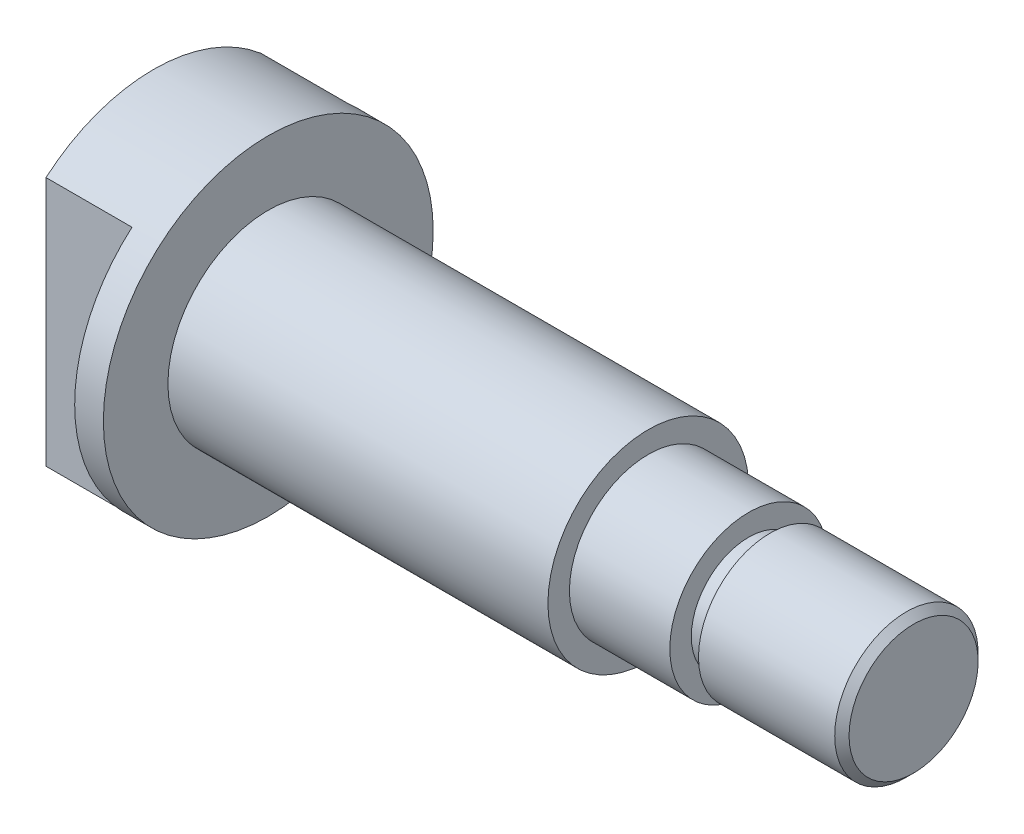
ISO-10303-21;
HEADER;
FILE_DESCRIPTION(('STEP AP214'),'2;1');
FILE_NAME('part.step','',(''),(''),'','','');
FILE_SCHEMA(('AUTOMOTIVE_DESIGN { 1 0 10303 214 1 1 1 1 }'));
ENDSEC;
DATA;
#1=APPLICATION_CONTEXT('core data for automotive mechanical design processes');
#2=APPLICATION_PROTOCOL_DEFINITION('international standard','automotive_design',2000,#1);
#3=PRODUCT_CONTEXT('',#1,'mechanical');
#4=PRODUCT('Part','Part','',(#3));
#5=PRODUCT_RELATED_PRODUCT_CATEGORY('part','',(#4));
#6=PRODUCT_DEFINITION_FORMATION('','',#4);
#7=PRODUCT_DEFINITION_CONTEXT('part definition',#1,'design');
#8=PRODUCT_DEFINITION('design','',#6,#7);
#9=PRODUCT_DEFINITION_SHAPE('','',#8);
#10=(LENGTH_UNIT() NAMED_UNIT(*) SI_UNIT(.MILLI.,.METRE.));
#11=(NAMED_UNIT(*) PLANE_ANGLE_UNIT() SI_UNIT($,.RADIAN.));
#12=(NAMED_UNIT(*) SI_UNIT($,.STERADIAN.) SOLID_ANGLE_UNIT());
#13=UNCERTAINTY_MEASURE_WITH_UNIT(LENGTH_MEASURE(1.E-05),#10,'distance_accuracy_value','');
#14=(GEOMETRIC_REPRESENTATION_CONTEXT(3) GLOBAL_UNCERTAINTY_ASSIGNED_CONTEXT((#13)) GLOBAL_UNIT_ASSIGNED_CONTEXT((#10,
#11,#12)) REPRESENTATION_CONTEXT('',''));
#15=CARTESIAN_POINT('',(0.,0.,0.));
#16=DIRECTION('',(0.,0.,1.));
#17=DIRECTION('',(1.,0.,0.));
#18=AXIS2_PLACEMENT_3D('',#15,#16,#17);
#19=CARTESIAN_POINT('',(0.,0.,0.));
#20=DIRECTION('',(1.,0.,0.));
#21=DIRECTION('',(0.,0.,-1.));
#22=AXIS2_PLACEMENT_3D('',#19,#20,#21);
#23=PLANE('',#22);
#24=CARTESIAN_POINT('',(0.,0.,0.));
#25=DIRECTION('',(-1.,0.,0.));
#26=DIRECTION('',(0.,0.,1.));
#27=AXIS2_PLACEMENT_3D('',#24,#25,#26);
#28=CIRCLE('',#27,23.);
#29=CARTESIAN_POINT('',(0.,17.4355957741627,15.));
#30=VERTEX_POINT('',#29);
#31=CARTESIAN_POINT('',(0.,17.4355957741627,-15.));
#32=VERTEX_POINT('',#31);
#33=EDGE_CURVE('E106',#30,#32,#28,.T.);
#34=ORIENTED_EDGE('',*,*,#33,.T.);
#35=DIRECTION('',(0.,1.,0.));
#36=VECTOR('',#35,1.);
#37=CARTESIAN_POINT('',(0.,17.4355957741627,-15.));
#38=LINE('',#37,#36);
#39=CARTESIAN_POINT('',(0.,-17.4355957741627,-15.));
#40=VERTEX_POINT('',#39);
#41=EDGE_CURVE('E93',#40,#32,#38,.T.);
#42=ORIENTED_EDGE('',*,*,#41,.F.);
#43=CARTESIAN_POINT('',(0.,-17.4355957741627,15.));
#44=VERTEX_POINT('',#43);
#45=EDGE_CURVE('E104',#40,#44,#28,.T.);
#46=ORIENTED_EDGE('',*,*,#45,.T.);
#47=DIRECTION('',(0.,-1.,0.));
#48=VECTOR('',#47,1.);
#49=CARTESIAN_POINT('',(0.,17.4355957741627,15.));
#50=LINE('',#49,#48);
#51=EDGE_CURVE('E191',#30,#44,#50,.T.);
#52=ORIENTED_EDGE('',*,*,#51,.F.);
#53=EDGE_LOOP('',(#34,#42,#46,#52));
#54=FACE_BOUND('',#53,.T.);
#55=ADVANCED_FACE('F49',(#54),#23,.F.);
#56=CARTESIAN_POINT('',(0.,0.,0.));
#57=DIRECTION('',(-1.,0.,0.));
#58=DIRECTION('',(0.,0.,1.));
#59=AXIS2_PLACEMENT_3D('',#56,#57,#58);
#60=CYLINDRICAL_SURFACE('',#59,23.);
#61=CARTESIAN_POINT('',(12.,0.,0.));
#62=DIRECTION('',(-1.,0.,0.));
#63=DIRECTION('',(0.,0.,1.));
#64=AXIS2_PLACEMENT_3D('',#61,#62,#63);
#65=CIRCLE('',#64,23.);
#66=CARTESIAN_POINT('',(12.,17.4355957741627,-15.));
#67=VERTEX_POINT('',#66);
#68=CARTESIAN_POINT('',(12.,-17.4355957741627,-15.));
#69=VERTEX_POINT('',#68);
#70=EDGE_CURVE('E107',#67,#69,#65,.T.);
#71=ORIENTED_EDGE('',*,*,#70,.F.);
#72=DIRECTION('',(-1.,0.,0.));
#73=VECTOR('',#72,1.);
#74=CARTESIAN_POINT('',(12.,17.4355957741627,-15.));
#75=LINE('',#74,#73);
#76=EDGE_CURVE('E98',#67,#32,#75,.T.);
#77=ORIENTED_EDGE('',*,*,#76,.T.);
#78=ORIENTED_EDGE('',*,*,#33,.F.);
#79=DIRECTION('',(-1.,0.,0.));
#80=VECTOR('',#79,1.);
#81=CARTESIAN_POINT('',(12.,17.4355957741627,15.));
#82=LINE('',#81,#80);
#83=CARTESIAN_POINT('',(12.,17.4355957741627,15.));
#84=VERTEX_POINT('',#83);
#85=EDGE_CURVE('E193',#84,#30,#82,.T.);
#86=ORIENTED_EDGE('',*,*,#85,.F.);
#87=CARTESIAN_POINT('',(12.,0.,0.));
#88=DIRECTION('',(-1.,0.,0.));
#89=DIRECTION('',(0.,0.,1.));
#90=AXIS2_PLACEMENT_3D('',#87,#88,#89);
#91=CIRCLE('',#90,23.);
#92=CARTESIAN_POINT('',(12.,-17.4355957741627,15.));
#93=VERTEX_POINT('',#92);
#94=EDGE_CURVE('E189',#93,#84,#91,.T.);
#95=ORIENTED_EDGE('',*,*,#94,.F.);
#96=DIRECTION('',(-1.,0.,0.));
#97=VECTOR('',#96,1.);
#98=CARTESIAN_POINT('',(12.,-17.4355957741627,15.));
#99=LINE('',#98,#97);
#100=EDGE_CURVE('E108',#93,#44,#99,.T.);
#101=ORIENTED_EDGE('',*,*,#100,.T.);
#102=ORIENTED_EDGE('',*,*,#45,.F.);
#103=DIRECTION('',(-1.,0.,0.));
#104=VECTOR('',#103,1.);
#105=CARTESIAN_POINT('',(12.,-17.4355957741627,-15.));
#106=LINE('',#105,#104);
#107=EDGE_CURVE('E90',#69,#40,#106,.T.);
#108=ORIENTED_EDGE('',*,*,#107,.F.);
#109=EDGE_LOOP('',(#71,#77,#78,#86,#95,#101,#102,#108));
#110=FACE_BOUND('',#109,.T.);
#111=CARTESIAN_POINT('',(16.,0.,0.));
#112=DIRECTION('',(-1.,0.,0.));
#113=DIRECTION('',(0.,0.,1.));
#114=AXIS2_PLACEMENT_3D('',#111,#112,#113);
#115=CIRCLE('',#114,23.);
#116=CARTESIAN_POINT('',(16.,0.,23.));
#117=VERTEX_POINT('',#116);
#118=EDGE_CURVE('E114',#117,#117,#115,.T.);
#119=ORIENTED_EDGE('',*,*,#118,.T.);
#120=EDGE_LOOP('',(#119));
#121=FACE_BOUND('',#120,.T.);
#122=ADVANCED_FACE('F111',(#110,#121),#60,.T.);
#123=CARTESIAN_POINT('',(16.,23.,0.));
#124=DIRECTION('',(-1.,0.,0.));
#125=DIRECTION('',(0.,0.,1.));
#126=AXIS2_PLACEMENT_3D('',#123,#124,#125);
#127=PLANE('',#126);
#128=ORIENTED_EDGE('',*,*,#118,.F.);
#129=EDGE_LOOP('',(#128));
#130=FACE_BOUND('',#129,.T.);
#131=CARTESIAN_POINT('',(16.,0.,0.));
#132=DIRECTION('',(-1.,0.,0.));
#133=DIRECTION('',(0.,0.,1.));
#134=AXIS2_PLACEMENT_3D('',#131,#132,#133);
#135=CIRCLE('',#134,14.);
#136=CARTESIAN_POINT('',(16.,0.,14.));
#137=VERTEX_POINT('',#136);
#138=EDGE_CURVE('E117',#137,#137,#135,.T.);
#139=ORIENTED_EDGE('',*,*,#138,.T.);
#140=EDGE_LOOP('',(#139));
#141=FACE_BOUND('',#140,.T.);
#142=ADVANCED_FACE('F144',(#130,#141),#127,.F.);
#143=CARTESIAN_POINT('',(0.,0.,0.));
#144=DIRECTION('',(-1.,0.,0.));
#145=DIRECTION('',(0.,0.,1.));
#146=AXIS2_PLACEMENT_3D('',#143,#144,#145);
#147=CYLINDRICAL_SURFACE('',#146,14.);
#148=ORIENTED_EDGE('',*,*,#138,.F.);
#149=EDGE_LOOP('',(#148));
#150=FACE_BOUND('',#149,.T.);
#151=CARTESIAN_POINT('',(69.,0.,0.));
#152=DIRECTION('',(-1.,0.,0.));
#153=DIRECTION('',(0.,0.,1.));
#154=AXIS2_PLACEMENT_3D('',#151,#152,#153);
#155=CIRCLE('',#154,14.);
#156=CARTESIAN_POINT('',(69.,0.,14.));
#157=VERTEX_POINT('',#156);
#158=EDGE_CURVE('E211',#157,#157,#155,.T.);
#159=ORIENTED_EDGE('',*,*,#158,.T.);
#160=EDGE_LOOP('',(#159));
#161=FACE_BOUND('',#160,.T.);
#162=ADVANCED_FACE('F149',(#150,#161),#147,.T.);
#163=CARTESIAN_POINT('',(69.,14.,0.));
#164=DIRECTION('',(-1.,0.,0.));
#165=DIRECTION('',(0.,0.,1.));
#166=AXIS2_PLACEMENT_3D('',#163,#164,#165);
#167=PLANE('',#166);
#168=ORIENTED_EDGE('',*,*,#158,.F.);
#169=EDGE_LOOP('',(#168));
#170=FACE_BOUND('',#169,.T.);
#171=CARTESIAN_POINT('',(69.,0.,0.));
#172=DIRECTION('',(-1.,0.,0.));
#173=DIRECTION('',(0.,0.,1.));
#174=AXIS2_PLACEMENT_3D('',#171,#172,#173);
#175=CIRCLE('',#174,11.);
#176=CARTESIAN_POINT('',(69.,0.,11.));
#177=VERTEX_POINT('',#176);
#178=EDGE_CURVE('E208',#177,#177,#175,.T.);
#179=ORIENTED_EDGE('',*,*,#178,.T.);
#180=EDGE_LOOP('',(#179));
#181=FACE_BOUND('',#180,.T.);
#182=ADVANCED_FACE('F153',(#170,#181),#167,.F.);
#183=CARTESIAN_POINT('',(0.,0.,0.));
#184=DIRECTION('',(-1.,0.,0.));
#185=DIRECTION('',(0.,0.,1.));
#186=AXIS2_PLACEMENT_3D('',#183,#184,#185);
#187=CYLINDRICAL_SURFACE('',#186,11.);
#188=ORIENTED_EDGE('',*,*,#178,.F.);
#189=EDGE_LOOP('',(#188));
#190=FACE_BOUND('',#189,.T.);
#191=CARTESIAN_POINT('',(83.,0.,0.));
#192=DIRECTION('',(-1.,0.,0.));
#193=DIRECTION('',(0.,0.,1.));
#194=AXIS2_PLACEMENT_3D('',#191,#192,#193);
#195=CIRCLE('',#194,11.);
#196=CARTESIAN_POINT('',(83.,0.,11.));
#197=VERTEX_POINT('',#196);
#198=EDGE_CURVE('E205',#197,#197,#195,.T.);
#199=ORIENTED_EDGE('',*,*,#198,.T.);
#200=EDGE_LOOP('',(#199));
#201=FACE_BOUND('',#200,.T.);
#202=ADVANCED_FACE('F157',(#190,#201),#187,.T.);
#203=CARTESIAN_POINT('',(83.,11.,0.));
#204=DIRECTION('',(-1.,0.,0.));
#205=DIRECTION('',(0.,0.,1.));
#206=AXIS2_PLACEMENT_3D('',#203,#204,#205);
#207=PLANE('',#206);
#208=ORIENTED_EDGE('',*,*,#198,.F.);
#209=EDGE_LOOP('',(#208));
#210=FACE_BOUND('',#209,.T.);
#211=CARTESIAN_POINT('',(83.,0.,0.));
#212=DIRECTION('',(-1.,0.,0.));
#213=DIRECTION('',(0.,0.,1.));
#214=AXIS2_PLACEMENT_3D('',#211,#212,#213);
#215=CIRCLE('',#214,8.);
#216=CARTESIAN_POINT('',(83.,0.,8.));
#217=VERTEX_POINT('',#216);
#218=EDGE_CURVE('E202',#217,#217,#215,.T.);
#219=ORIENTED_EDGE('',*,*,#218,.T.);
#220=EDGE_LOOP('',(#219));
#221=FACE_BOUND('',#220,.T.);
#222=ADVANCED_FACE('F161',(#210,#221),#207,.F.);
#223=CARTESIAN_POINT('',(0.,0.,0.));
#224=DIRECTION('',(-1.,0.,0.));
#225=DIRECTION('',(0.,0.,1.));
#226=AXIS2_PLACEMENT_3D('',#223,#224,#225);
#227=CYLINDRICAL_SURFACE('',#226,8.);
#228=ORIENTED_EDGE('',*,*,#218,.F.);
#229=EDGE_LOOP('',(#228));
#230=FACE_BOUND('',#229,.T.);
#231=CARTESIAN_POINT('',(86.,0.,0.));
#232=DIRECTION('',(-1.,0.,0.));
#233=DIRECTION('',(0.,0.,1.));
#234=AXIS2_PLACEMENT_3D('',#231,#232,#233);
#235=CIRCLE('',#234,8.);
#236=CARTESIAN_POINT('',(86.,0.,8.));
#237=VERTEX_POINT('',#236);
#238=EDGE_CURVE('E199',#237,#237,#235,.T.);
#239=ORIENTED_EDGE('',*,*,#238,.T.);
#240=EDGE_LOOP('',(#239));
#241=FACE_BOUND('',#240,.T.);
#242=ADVANCED_FACE('F165',(#230,#241),#227,.T.);
#243=CARTESIAN_POINT('',(86.,8.,0.));
#244=DIRECTION('',(1.,0.,0.));
#245=DIRECTION('',(0.,0.,-1.));
#246=AXIS2_PLACEMENT_3D('',#243,#244,#245);
#247=PLANE('',#246);
#248=ORIENTED_EDGE('',*,*,#238,.F.);
#249=EDGE_LOOP('',(#248));
#250=FACE_BOUND('',#249,.T.);
#251=CARTESIAN_POINT('',(86.,0.,0.));
#252=DIRECTION('',(-1.,0.,0.));
#253=DIRECTION('',(0.,0.,1.));
#254=AXIS2_PLACEMENT_3D('',#251,#252,#253);
#255=CIRCLE('',#254,10.);
#256=CARTESIAN_POINT('',(86.,0.,10.));
#257=VERTEX_POINT('',#256);
#258=EDGE_CURVE('E187',#257,#257,#255,.T.);
#259=ORIENTED_EDGE('',*,*,#258,.T.);
#260=EDGE_LOOP('',(#259));
#261=FACE_BOUND('',#260,.T.);
#262=ADVANCED_FACE('F169',(#250,#261),#247,.F.);
#263=CARTESIAN_POINT('',(0.,0.,0.));
#264=DIRECTION('',(-1.,0.,0.));
#265=DIRECTION('',(0.,0.,1.));
#266=AXIS2_PLACEMENT_3D('',#263,#264,#265);
#267=CYLINDRICAL_SURFACE('',#266,10.);
#268=CARTESIAN_POINT('',(105.,0.,0.));
#269=DIRECTION('',(-1.,0.,0.));
#270=DIRECTION('',(0.,0.,1.));
#271=AXIS2_PLACEMENT_3D('',#268,#269,#270);
#272=CIRCLE('',#271,10.);
#273=CARTESIAN_POINT('',(105.,0.,10.));
#274=VERTEX_POINT('',#273);
#275=EDGE_CURVE('E58',#274,#274,#272,.T.);
#276=ORIENTED_EDGE('',*,*,#275,.T.);
#277=EDGE_LOOP('',(#276));
#278=FACE_BOUND('',#277,.T.);
#279=ORIENTED_EDGE('',*,*,#258,.F.);
#280=EDGE_LOOP('',(#279));
#281=FACE_BOUND('',#280,.T.);
#282=ADVANCED_FACE('F123',(#278,#281),#267,.T.);
#283=CARTESIAN_POINT('',(106.,10.,0.));
#284=DIRECTION('',(-1.,0.,0.));
#285=DIRECTION('',(0.,0.,1.));
#286=AXIS2_PLACEMENT_3D('',#283,#284,#285);
#287=PLANE('',#286);
#288=CARTESIAN_POINT('',(106.,0.,0.));
#289=DIRECTION('',(-1.,0.,0.));
#290=DIRECTION('',(0.,0.,1.));
#291=AXIS2_PLACEMENT_3D('',#288,#289,#290);
#292=CIRCLE('',#291,8.99999999999997);
#293=CARTESIAN_POINT('',(106.,0.,8.99999999999997));
#294=VERTEX_POINT('',#293);
#295=EDGE_CURVE('E11',#294,#294,#292,.F.);
#296=ORIENTED_EDGE('',*,*,#295,.T.);
#297=EDGE_LOOP('',(#296));
#298=FACE_BOUND('',#297,.T.);
#299=ADVANCED_FACE('F128',(#298),#287,.F.);
#300=CARTESIAN_POINT('',(105.,0.,0.));
#301=DIRECTION('',(-1.,0.,0.));
#302=DIRECTION('',(0.,0.,1.));
#303=AXIS2_PLACEMENT_3D('',#300,#301,#302);
#304=CONICAL_SURFACE('',#303,10.,0.785398163397444);
#305=ORIENTED_EDGE('',*,*,#295,.F.);
#306=EDGE_LOOP('',(#305));
#307=FACE_BOUND('',#306,.T.);
#308=ORIENTED_EDGE('',*,*,#275,.F.);
#309=EDGE_LOOP('',(#308));
#310=FACE_BOUND('',#309,.T.);
#311=ADVANCED_FACE('F52',(#307,#310),#304,.T.);
#312=CARTESIAN_POINT('',(12.,17.4355957741627,15.));
#313=DIRECTION('',(0.,0.,-1.));
#314=DIRECTION('',(-1.,0.,0.));
#315=AXIS2_PLACEMENT_3D('',#312,#313,#314);
#316=PLANE('',#315);
#317=ORIENTED_EDGE('',*,*,#51,.T.);
#318=ORIENTED_EDGE('',*,*,#100,.F.);
#319=DIRECTION('',(0.,-1.,0.));
#320=VECTOR('',#319,1.);
#321=CARTESIAN_POINT('',(12.,17.4355957741627,15.));
#322=LINE('',#321,#320);
#323=EDGE_CURVE('E71',#84,#93,#322,.T.);
#324=ORIENTED_EDGE('',*,*,#323,.F.);
#325=ORIENTED_EDGE('',*,*,#85,.T.);
#326=EDGE_LOOP('',(#317,#318,#324,#325));
#327=FACE_BOUND('',#326,.T.);
#328=ADVANCED_FACE('F127',(#327),#316,.F.);
#329=CARTESIAN_POINT('',(12.,0.,0.));
#330=DIRECTION('',(-1.,0.,0.));
#331=DIRECTION('',(0.,0.,1.));
#332=AXIS2_PLACEMENT_3D('',#329,#330,#331);
#333=PLANE('',#332);
#334=ORIENTED_EDGE('',*,*,#94,.T.);
#335=ORIENTED_EDGE('',*,*,#323,.T.);
#336=EDGE_LOOP('',(#334,#335));
#337=FACE_BOUND('',#336,.T.);
#338=ADVANCED_FACE('F134',(#337),#333,.T.);
#339=CARTESIAN_POINT('',(12.,17.4355957741627,-15.));
#340=DIRECTION('',(0.,0.,1.));
#341=DIRECTION('',(1.,0.,0.));
#342=AXIS2_PLACEMENT_3D('',#339,#340,#341);
#343=PLANE('',#342);
#344=ORIENTED_EDGE('',*,*,#41,.T.);
#345=ORIENTED_EDGE('',*,*,#76,.F.);
#346=DIRECTION('',(0.,1.,0.));
#347=VECTOR('',#346,1.);
#348=CARTESIAN_POINT('',(12.,17.4355957741627,-15.));
#349=LINE('',#348,#347);
#350=EDGE_CURVE('E64',#69,#67,#349,.T.);
#351=ORIENTED_EDGE('',*,*,#350,.F.);
#352=ORIENTED_EDGE('',*,*,#107,.T.);
#353=EDGE_LOOP('',(#344,#345,#351,#352));
#354=FACE_BOUND('',#353,.T.);
#355=ADVANCED_FACE('F92',(#354),#343,.F.);
#356=CARTESIAN_POINT('',(12.,0.,0.));
#357=DIRECTION('',(-1.,0.,0.));
#358=DIRECTION('',(0.,0.,1.));
#359=AXIS2_PLACEMENT_3D('',#356,#357,#358);
#360=PLANE('',#359);
#361=ORIENTED_EDGE('',*,*,#70,.T.);
#362=ORIENTED_EDGE('',*,*,#350,.T.);
#363=EDGE_LOOP('',(#361,#362));
#364=FACE_BOUND('',#363,.T.);
#365=ADVANCED_FACE('F180',(#364),#360,.T.);
#366=CLOSED_SHELL('',(#55,#122,#142,#162,#182,#202,#222,#242,#262,#282,#299,#311,#328,#338,#355,#365));
#367=MANIFOLD_SOLID_BREP('B2',#366);
#368=ADVANCED_BREP_SHAPE_REPRESENTATION('',(#18,#367),#14);
#369=SHAPE_DEFINITION_REPRESENTATION(#9,#368);
ENDSEC;
END-ISO-10303-21;
